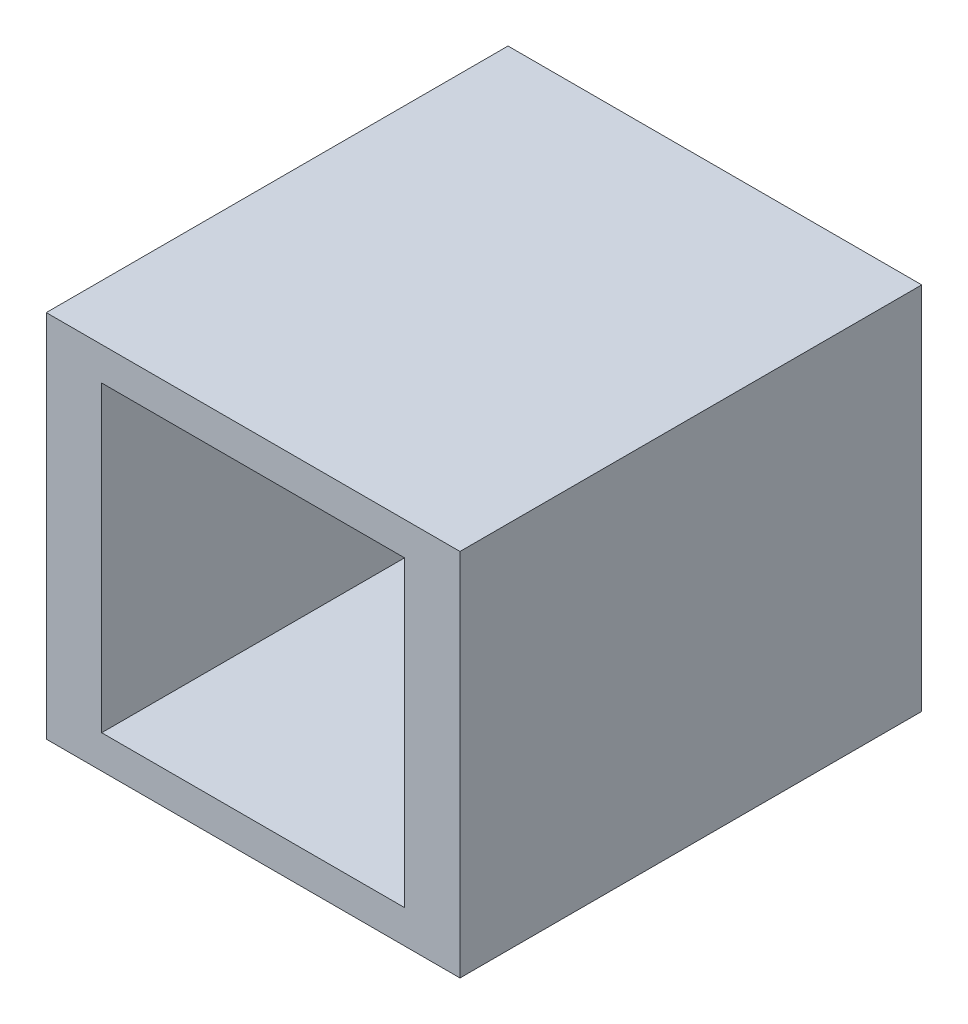
ISO-10303-21;
HEADER;
FILE_DESCRIPTION(('STEP AP214'),'2;1');
FILE_NAME('part.step','',(''),(''),'','','');
FILE_SCHEMA(('AUTOMOTIVE_DESIGN { 1 0 10303 214 1 1 1 1 }'));
ENDSEC;
DATA;
#1=APPLICATION_CONTEXT('core data for automotive mechanical design processes');
#2=APPLICATION_PROTOCOL_DEFINITION('international standard','automotive_design',2000,#1);
#3=PRODUCT_CONTEXT('',#1,'mechanical');
#4=PRODUCT('Part','Part','',(#3));
#5=PRODUCT_RELATED_PRODUCT_CATEGORY('part','',(#4));
#6=PRODUCT_DEFINITION_FORMATION('','',#4);
#7=PRODUCT_DEFINITION_CONTEXT('part definition',#1,'design');
#8=PRODUCT_DEFINITION('design','',#6,#7);
#9=PRODUCT_DEFINITION_SHAPE('','',#8);
#10=(LENGTH_UNIT() NAMED_UNIT(*) SI_UNIT(.MILLI.,.METRE.));
#11=(NAMED_UNIT(*) PLANE_ANGLE_UNIT() SI_UNIT($,.RADIAN.));
#12=(NAMED_UNIT(*) SI_UNIT($,.STERADIAN.) SOLID_ANGLE_UNIT());
#13=UNCERTAINTY_MEASURE_WITH_UNIT(LENGTH_MEASURE(1.E-05),#10,'distance_accuracy_value','');
#14=(GEOMETRIC_REPRESENTATION_CONTEXT(3) GLOBAL_UNCERTAINTY_ASSIGNED_CONTEXT((#13)) GLOBAL_UNIT_ASSIGNED_CONTEXT((#10,
#11,#12)) REPRESENTATION_CONTEXT('',''));
#15=CARTESIAN_POINT('',(0.,0.,0.));
#16=DIRECTION('',(0.,0.,1.));
#17=DIRECTION('',(1.,0.,0.));
#18=AXIS2_PLACEMENT_3D('',#15,#16,#17);
#19=CARTESIAN_POINT('',(0.,-10.,20.));
#20=DIRECTION('',(0.,1.,0.));
#21=DIRECTION('',(0.,0.,1.));
#22=AXIS2_PLACEMENT_3D('',#19,#20,#21);
#23=PLANE('',#22);
#24=DIRECTION('',(0.,0.,-1.));
#25=VECTOR('',#24,1.);
#26=CARTESIAN_POINT('',(-11.2,-10.,20.));
#27=LINE('',#26,#25);
#28=CARTESIAN_POINT('',(-11.2,-10.,20.));
#29=VERTEX_POINT('',#28);
#30=CARTESIAN_POINT('',(-11.2,-10.,-5.));
#31=VERTEX_POINT('',#30);
#32=EDGE_CURVE('E56',#29,#31,#27,.T.);
#33=ORIENTED_EDGE('',*,*,#32,.T.);
#34=DIRECTION('',(1.,0.,0.));
#35=VECTOR('',#34,1.);
#36=CARTESIAN_POINT('',(-11.2,-10.,-5.));
#37=LINE('',#36,#35);
#38=CARTESIAN_POINT('',(11.2,-10.,-5.));
#39=VERTEX_POINT('',#38);
#40=EDGE_CURVE('E175',#31,#39,#37,.T.);
#41=ORIENTED_EDGE('',*,*,#40,.T.);
#42=DIRECTION('',(0.,0.,-1.));
#43=VECTOR('',#42,1.);
#44=CARTESIAN_POINT('',(11.2,-10.,20.));
#45=LINE('',#44,#43);
#46=CARTESIAN_POINT('',(11.2,-10.,20.));
#47=VERTEX_POINT('',#46);
#48=EDGE_CURVE('E11',#47,#39,#45,.T.);
#49=ORIENTED_EDGE('',*,*,#48,.F.);
#50=DIRECTION('',(1.,0.,0.));
#51=VECTOR('',#50,1.);
#52=CARTESIAN_POINT('',(0.,-10.,20.));
#53=LINE('',#52,#51);
#54=EDGE_CURVE('E109',#29,#47,#53,.T.);
#55=ORIENTED_EDGE('',*,*,#54,.F.);
#56=EDGE_LOOP('',(#33,#41,#49,#55));
#57=FACE_BOUND('',#56,.T.);
#58=ADVANCED_FACE('F37',(#57),#23,.F.);
#59=CARTESIAN_POINT('',(11.2,0.,20.));
#60=DIRECTION('',(-1.,0.,0.));
#61=DIRECTION('',(0.,0.,1.));
#62=AXIS2_PLACEMENT_3D('',#59,#60,#61);
#63=PLANE('',#62);
#64=ORIENTED_EDGE('',*,*,#48,.T.);
#65=DIRECTION('',(0.,1.,0.));
#66=VECTOR('',#65,1.);
#67=CARTESIAN_POINT('',(11.2,-10.,-5.));
#68=LINE('',#67,#66);
#69=CARTESIAN_POINT('',(11.2,10.,-5.));
#70=VERTEX_POINT('',#69);
#71=EDGE_CURVE('E118',#39,#70,#68,.T.);
#72=ORIENTED_EDGE('',*,*,#71,.T.);
#73=DIRECTION('',(0.,0.,-1.));
#74=VECTOR('',#73,1.);
#75=CARTESIAN_POINT('',(11.2,10.,20.));
#76=LINE('',#75,#74);
#77=CARTESIAN_POINT('',(11.2,10.,20.));
#78=VERTEX_POINT('',#77);
#79=EDGE_CURVE('E47',#78,#70,#76,.T.);
#80=ORIENTED_EDGE('',*,*,#79,.F.);
#81=DIRECTION('',(0.,1.,0.));
#82=VECTOR('',#81,1.);
#83=CARTESIAN_POINT('',(11.2,0.,20.));
#84=LINE('',#83,#82);
#85=EDGE_CURVE('E103',#47,#78,#84,.T.);
#86=ORIENTED_EDGE('',*,*,#85,.F.);
#87=EDGE_LOOP('',(#64,#72,#80,#86));
#88=FACE_BOUND('',#87,.T.);
#89=ADVANCED_FACE('F115',(#88),#63,.F.);
#90=CARTESIAN_POINT('',(0.,10.,20.));
#91=DIRECTION('',(0.,1.,0.));
#92=DIRECTION('',(0.,0.,1.));
#93=AXIS2_PLACEMENT_3D('',#90,#91,#92);
#94=PLANE('',#93);
#95=ORIENTED_EDGE('',*,*,#79,.T.);
#96=DIRECTION('',(1.,0.,0.));
#97=VECTOR('',#96,1.);
#98=CARTESIAN_POINT('',(-11.2,10.,-5.));
#99=LINE('',#98,#97);
#100=CARTESIAN_POINT('',(-11.2,10.,-5.));
#101=VERTEX_POINT('',#100);
#102=EDGE_CURVE('E172',#101,#70,#99,.T.);
#103=ORIENTED_EDGE('',*,*,#102,.F.);
#104=DIRECTION('',(0.,0.,-1.));
#105=VECTOR('',#104,1.);
#106=CARTESIAN_POINT('',(-11.2,10.,20.));
#107=LINE('',#106,#105);
#108=CARTESIAN_POINT('',(-11.2,10.,20.));
#109=VERTEX_POINT('',#108);
#110=EDGE_CURVE('E122',#109,#101,#107,.T.);
#111=ORIENTED_EDGE('',*,*,#110,.F.);
#112=DIRECTION('',(1.,0.,0.));
#113=VECTOR('',#112,1.);
#114=CARTESIAN_POINT('',(0.,10.,20.));
#115=LINE('',#114,#113);
#116=EDGE_CURVE('E108',#109,#78,#115,.T.);
#117=ORIENTED_EDGE('',*,*,#116,.T.);
#118=EDGE_LOOP('',(#95,#103,#111,#117));
#119=FACE_BOUND('',#118,.T.);
#120=ADVANCED_FACE('F124',(#119),#94,.T.);
#121=CARTESIAN_POINT('',(8.2,0.,20.));
#122=DIRECTION('',(-1.,0.,0.));
#123=DIRECTION('',(0.,0.,1.));
#124=AXIS2_PLACEMENT_3D('',#121,#122,#123);
#125=PLANE('',#124);
#126=DIRECTION('',(0.,1.,0.));
#127=VECTOR('',#126,1.);
#128=CARTESIAN_POINT('',(8.2,0.,0.));
#129=LINE('',#128,#127);
#130=CARTESIAN_POINT('',(8.2,-8.2,0.));
#131=VERTEX_POINT('',#130);
#132=CARTESIAN_POINT('',(8.2,8.2,0.));
#133=VERTEX_POINT('',#132);
#134=EDGE_CURVE('E131',#131,#133,#129,.T.);
#135=ORIENTED_EDGE('',*,*,#134,.F.);
#136=DIRECTION('',(0.,0.,-1.));
#137=VECTOR('',#136,1.);
#138=CARTESIAN_POINT('',(8.2,-8.2,20.));
#139=LINE('',#138,#137);
#140=CARTESIAN_POINT('',(8.2,-8.2,20.));
#141=VERTEX_POINT('',#140);
#142=EDGE_CURVE('E41',#141,#131,#139,.T.);
#143=ORIENTED_EDGE('',*,*,#142,.F.);
#144=DIRECTION('',(0.,1.,0.));
#145=VECTOR('',#144,1.);
#146=CARTESIAN_POINT('',(8.2,0.,20.));
#147=LINE('',#146,#145);
#148=CARTESIAN_POINT('',(8.2,8.2,20.));
#149=VERTEX_POINT('',#148);
#150=EDGE_CURVE('E141',#141,#149,#147,.T.);
#151=ORIENTED_EDGE('',*,*,#150,.T.);
#152=DIRECTION('',(0.,0.,-1.));
#153=VECTOR('',#152,1.);
#154=CARTESIAN_POINT('',(8.2,8.2,20.));
#155=LINE('',#154,#153);
#156=EDGE_CURVE('E79',#149,#133,#155,.T.);
#157=ORIENTED_EDGE('',*,*,#156,.T.);
#158=EDGE_LOOP('',(#135,#143,#151,#157));
#159=FACE_BOUND('',#158,.T.);
#160=ADVANCED_FACE('F39',(#159),#125,.T.);
#161=CARTESIAN_POINT('',(0.,-8.2,20.));
#162=DIRECTION('',(0.,1.,0.));
#163=DIRECTION('',(0.,0.,1.));
#164=AXIS2_PLACEMENT_3D('',#161,#162,#163);
#165=PLANE('',#164);
#166=DIRECTION('',(1.,0.,0.));
#167=VECTOR('',#166,1.);
#168=CARTESIAN_POINT('',(0.,-8.2,0.));
#169=LINE('',#168,#167);
#170=CARTESIAN_POINT('',(-8.2,-8.2,0.));
#171=VERTEX_POINT('',#170);
#172=EDGE_CURVE('E134',#171,#131,#169,.T.);
#173=ORIENTED_EDGE('',*,*,#172,.F.);
#174=DIRECTION('',(0.,0.,-1.));
#175=VECTOR('',#174,1.);
#176=CARTESIAN_POINT('',(-8.2,-8.2,20.));
#177=LINE('',#176,#175);
#178=CARTESIAN_POINT('',(-8.2,-8.2,20.));
#179=VERTEX_POINT('',#178);
#180=EDGE_CURVE('E146',#179,#171,#177,.T.);
#181=ORIENTED_EDGE('',*,*,#180,.F.);
#182=DIRECTION('',(1.,0.,0.));
#183=VECTOR('',#182,1.);
#184=CARTESIAN_POINT('',(0.,-8.2,20.));
#185=LINE('',#184,#183);
#186=EDGE_CURVE('E153',#179,#141,#185,.T.);
#187=ORIENTED_EDGE('',*,*,#186,.T.);
#188=ORIENTED_EDGE('',*,*,#142,.T.);
#189=EDGE_LOOP('',(#173,#181,#187,#188));
#190=FACE_BOUND('',#189,.T.);
#191=ADVANCED_FACE('F151',(#190),#165,.T.);
#192=CARTESIAN_POINT('',(-8.2,0.,20.));
#193=DIRECTION('',(-1.,0.,0.));
#194=DIRECTION('',(0.,0.,1.));
#195=AXIS2_PLACEMENT_3D('',#192,#193,#194);
#196=PLANE('',#195);
#197=DIRECTION('',(0.,1.,0.));
#198=VECTOR('',#197,1.);
#199=CARTESIAN_POINT('',(-8.2,0.,0.));
#200=LINE('',#199,#198);
#201=CARTESIAN_POINT('',(-8.2,8.2,0.));
#202=VERTEX_POINT('',#201);
#203=EDGE_CURVE('E71',#171,#202,#200,.T.);
#204=ORIENTED_EDGE('',*,*,#203,.T.);
#205=DIRECTION('',(0.,0.,-1.));
#206=VECTOR('',#205,1.);
#207=CARTESIAN_POINT('',(-8.2,8.2,20.));
#208=LINE('',#207,#206);
#209=CARTESIAN_POINT('',(-8.2,8.2,20.));
#210=VERTEX_POINT('',#209);
#211=EDGE_CURVE('E145',#210,#202,#208,.T.);
#212=ORIENTED_EDGE('',*,*,#211,.F.);
#213=DIRECTION('',(0.,1.,0.));
#214=VECTOR('',#213,1.);
#215=CARTESIAN_POINT('',(-8.2,0.,20.));
#216=LINE('',#215,#214);
#217=EDGE_CURVE('E163',#179,#210,#216,.T.);
#218=ORIENTED_EDGE('',*,*,#217,.F.);
#219=ORIENTED_EDGE('',*,*,#180,.T.);
#220=EDGE_LOOP('',(#204,#212,#218,#219));
#221=FACE_BOUND('',#220,.T.);
#222=ADVANCED_FACE('F162',(#221),#196,.F.);
#223=CARTESIAN_POINT('',(0.,8.2,20.));
#224=DIRECTION('',(0.,1.,0.));
#225=DIRECTION('',(0.,0.,1.));
#226=AXIS2_PLACEMENT_3D('',#223,#224,#225);
#227=PLANE('',#226);
#228=DIRECTION('',(1.,0.,0.));
#229=VECTOR('',#228,1.);
#230=CARTESIAN_POINT('',(0.,8.2,0.));
#231=LINE('',#230,#229);
#232=EDGE_CURVE('E139',#202,#133,#231,.T.);
#233=ORIENTED_EDGE('',*,*,#232,.T.);
#234=ORIENTED_EDGE('',*,*,#156,.F.);
#235=DIRECTION('',(1.,0.,0.));
#236=VECTOR('',#235,1.);
#237=CARTESIAN_POINT('',(0.,8.2,20.));
#238=LINE('',#237,#236);
#239=EDGE_CURVE('E161',#210,#149,#238,.T.);
#240=ORIENTED_EDGE('',*,*,#239,.F.);
#241=ORIENTED_EDGE('',*,*,#211,.T.);
#242=EDGE_LOOP('',(#233,#234,#240,#241));
#243=FACE_BOUND('',#242,.T.);
#244=ADVANCED_FACE('F159',(#243),#227,.F.);
#245=CARTESIAN_POINT('',(-11.2,0.,20.));
#246=DIRECTION('',(-1.,0.,0.));
#247=DIRECTION('',(0.,0.,1.));
#248=AXIS2_PLACEMENT_3D('',#245,#246,#247);
#249=PLANE('',#248);
#250=ORIENTED_EDGE('',*,*,#110,.T.);
#251=DIRECTION('',(0.,1.,0.));
#252=VECTOR('',#251,1.);
#253=CARTESIAN_POINT('',(-11.2,-10.,-5.));
#254=LINE('',#253,#252);
#255=EDGE_CURVE('E135',#31,#101,#254,.T.);
#256=ORIENTED_EDGE('',*,*,#255,.F.);
#257=ORIENTED_EDGE('',*,*,#32,.F.);
#258=DIRECTION('',(0.,1.,0.));
#259=VECTOR('',#258,1.);
#260=CARTESIAN_POINT('',(-11.2,0.,20.));
#261=LINE('',#260,#259);
#262=EDGE_CURVE('E126',#29,#109,#261,.T.);
#263=ORIENTED_EDGE('',*,*,#262,.T.);
#264=EDGE_LOOP('',(#250,#256,#257,#263));
#265=FACE_BOUND('',#264,.T.);
#266=ADVANCED_FACE('F186',(#265),#249,.T.);
#267=CARTESIAN_POINT('',(0.,0.,20.));
#268=DIRECTION('',(0.,0.,1.));
#269=DIRECTION('',(1.,0.,0.));
#270=AXIS2_PLACEMENT_3D('',#267,#268,#269);
#271=PLANE('',#270);
#272=ORIENTED_EDGE('',*,*,#150,.F.);
#273=ORIENTED_EDGE('',*,*,#186,.F.);
#274=ORIENTED_EDGE('',*,*,#217,.T.);
#275=ORIENTED_EDGE('',*,*,#239,.T.);
#276=EDGE_LOOP('',(#272,#273,#274,#275));
#277=FACE_BOUND('',#276,.T.);
#278=ORIENTED_EDGE('',*,*,#54,.T.);
#279=ORIENTED_EDGE('',*,*,#85,.T.);
#280=ORIENTED_EDGE('',*,*,#116,.F.);
#281=ORIENTED_EDGE('',*,*,#262,.F.);
#282=EDGE_LOOP('',(#278,#279,#280,#281));
#283=FACE_BOUND('',#282,.T.);
#284=ADVANCED_FACE('F105',(#277,#283),#271,.T.);
#285=CARTESIAN_POINT('',(0.,0.,0.));
#286=DIRECTION('',(0.,0.,1.));
#287=DIRECTION('',(1.,0.,0.));
#288=AXIS2_PLACEMENT_3D('',#285,#286,#287);
#289=PLANE('',#288);
#290=ORIENTED_EDGE('',*,*,#172,.T.);
#291=ORIENTED_EDGE('',*,*,#134,.T.);
#292=ORIENTED_EDGE('',*,*,#232,.F.);
#293=ORIENTED_EDGE('',*,*,#203,.F.);
#294=EDGE_LOOP('',(#290,#291,#292,#293));
#295=FACE_BOUND('',#294,.T.);
#296=ADVANCED_FACE('F156',(#295),#289,.T.);
#297=CARTESIAN_POINT('',(0.,0.,-5.));
#298=DIRECTION('',(0.,0.,1.));
#299=DIRECTION('',(1.,0.,0.));
#300=AXIS2_PLACEMENT_3D('',#297,#298,#299);
#301=PLANE('',#300);
#302=ORIENTED_EDGE('',*,*,#40,.F.);
#303=ORIENTED_EDGE('',*,*,#255,.T.);
#304=ORIENTED_EDGE('',*,*,#102,.T.);
#305=ORIENTED_EDGE('',*,*,#71,.F.);
#306=EDGE_LOOP('',(#302,#303,#304,#305));
#307=FACE_BOUND('',#306,.T.);
#308=ADVANCED_FACE('F182',(#307),#301,.F.);
#309=CLOSED_SHELL('',(#58,#89,#120,#160,#191,#222,#244,#266,#284,#296,#308));
#310=MANIFOLD_SOLID_BREP('B2',#309);
#311=ADVANCED_BREP_SHAPE_REPRESENTATION('',(#18,#310),#14);
#312=SHAPE_DEFINITION_REPRESENTATION(#9,#311);
ENDSEC;
END-ISO-10303-21;
